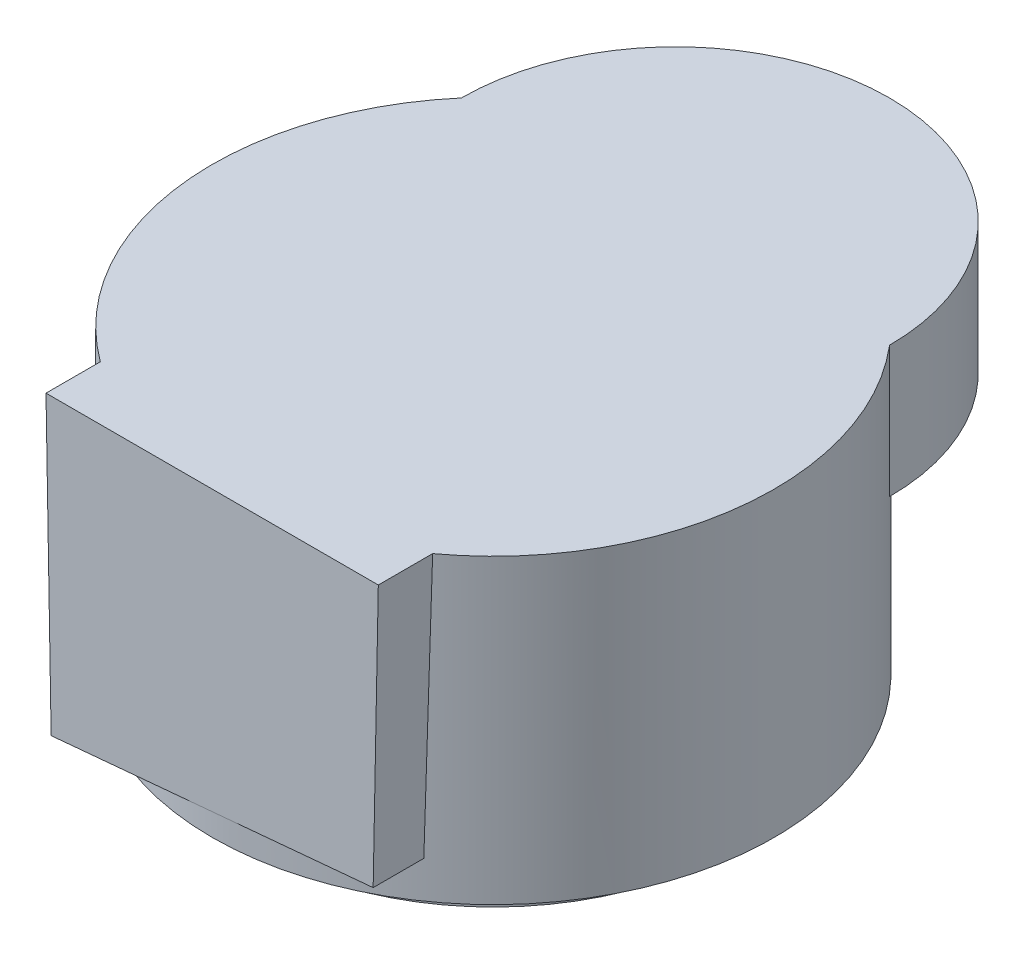
ISO-10303-21;
HEADER;
FILE_DESCRIPTION(('STEP AP214'),'2;1');
FILE_NAME('part.step','',(''),(''),'','','');
FILE_SCHEMA(('AUTOMOTIVE_DESIGN { 1 0 10303 214 1 1 1 1 }'));
ENDSEC;
DATA;
#1=APPLICATION_CONTEXT('core data for automotive mechanical design processes');
#2=APPLICATION_PROTOCOL_DEFINITION('international standard','automotive_design',2000,#1);
#3=PRODUCT_CONTEXT('',#1,'mechanical');
#4=PRODUCT('Part','Part','',(#3));
#5=PRODUCT_RELATED_PRODUCT_CATEGORY('part','',(#4));
#6=PRODUCT_DEFINITION_FORMATION('','',#4);
#7=PRODUCT_DEFINITION_CONTEXT('part definition',#1,'design');
#8=PRODUCT_DEFINITION('design','',#6,#7);
#9=PRODUCT_DEFINITION_SHAPE('','',#8);
#10=(LENGTH_UNIT() NAMED_UNIT(*) SI_UNIT(.MILLI.,.METRE.));
#11=(NAMED_UNIT(*) PLANE_ANGLE_UNIT() SI_UNIT($,.RADIAN.));
#12=(NAMED_UNIT(*) SI_UNIT($,.STERADIAN.) SOLID_ANGLE_UNIT());
#13=UNCERTAINTY_MEASURE_WITH_UNIT(LENGTH_MEASURE(1.E-05),#10,'distance_accuracy_value','');
#14=(GEOMETRIC_REPRESENTATION_CONTEXT(3) GLOBAL_UNCERTAINTY_ASSIGNED_CONTEXT((#13)) GLOBAL_UNIT_ASSIGNED_CONTEXT((#10,
#11,#12)) REPRESENTATION_CONTEXT('',''));
#15=CARTESIAN_POINT('',(0.,0.,0.));
#16=DIRECTION('',(0.,0.,1.));
#17=DIRECTION('',(1.,0.,0.));
#18=AXIS2_PLACEMENT_3D('',#15,#16,#17);
#19=CARTESIAN_POINT('',(0.,1.15,0.));
#20=DIRECTION('',(0.,-1.,0.));
#21=DIRECTION('',(0.,0.,-1.));
#22=AXIS2_PLACEMENT_3D('',#19,#20,#21);
#23=CYLINDRICAL_SURFACE('',#22,8.035);
#24=CARTESIAN_POINT('',(0.,1.15,0.));
#25=DIRECTION('',(0.,1.,0.));
#26=DIRECTION('',(0.,0.,1.));
#27=AXIS2_PLACEMENT_3D('',#24,#25,#26);
#28=CIRCLE('',#27,8.035);
#29=CARTESIAN_POINT('',(0.,1.15,8.035));
#30=VERTEX_POINT('',#29);
#31=EDGE_CURVE('E149',#30,#30,#28,.T.);
#32=ORIENTED_EDGE('',*,*,#31,.F.);
#33=EDGE_LOOP('',(#32));
#34=FACE_BOUND('',#33,.T.);
#35=CARTESIAN_POINT('',(0.,0.,0.));
#36=DIRECTION('',(0.,1.,0.));
#37=DIRECTION('',(0.,0.,1.));
#38=AXIS2_PLACEMENT_3D('',#35,#36,#37);
#39=CIRCLE('',#38,8.035);
#40=CARTESIAN_POINT('',(0.,0.,8.035));
#41=VERTEX_POINT('',#40);
#42=EDGE_CURVE('E145',#41,#41,#39,.T.);
#43=ORIENTED_EDGE('',*,*,#42,.T.);
#44=EDGE_LOOP('',(#43));
#45=FACE_BOUND('',#44,.T.);
#46=ADVANCED_FACE('F43',(#34,#45),#23,.T.);
#47=CARTESIAN_POINT('',(0.,0.,0.));
#48=DIRECTION('',(0.,1.,0.));
#49=DIRECTION('',(0.,0.,1.));
#50=AXIS2_PLACEMENT_3D('',#47,#48,#49);
#51=PLANE('',#50);
#52=ORIENTED_EDGE('',*,*,#42,.F.);
#53=EDGE_LOOP('',(#52));
#54=FACE_BOUND('',#53,.T.);
#55=ADVANCED_FACE('F186',(#54),#51,.F.);
#56=CARTESIAN_POINT('',(0.,11.41,0.));
#57=DIRECTION('',(0.,-1.,0.));
#58=DIRECTION('',(0.,0.,-1.));
#59=AXIS2_PLACEMENT_3D('',#56,#57,#58);
#60=CYLINDRICAL_SURFACE('',#59,9.56);
#61=CARTESIAN_POINT('',(0.,11.41,0.));
#62=DIRECTION('',(0.,1.,0.));
#63=DIRECTION('',(0.,0.,1.));
#64=AXIS2_PLACEMENT_3D('',#61,#62,#63);
#65=CIRCLE('',#64,9.56);
#66=CARTESIAN_POINT('',(5.65,11.41,7.71175077398122));
#67=VERTEX_POINT('',#66);
#68=CARTESIAN_POINT('',(7.28002476057905,11.41,-6.19635695270664));
#69=VERTEX_POINT('',#68);
#70=EDGE_CURVE('E146',#67,#69,#65,.T.);
#71=ORIENTED_EDGE('',*,*,#70,.F.);
#72=CARTESIAN_POINT('',(0.,-279.161428571425,0.));
#73=DIRECTION('',(0.999811010379242,-0.0194407696462633,0.));
#74=DIRECTION('',(-0.0194407696462633,-0.999811010379242,0.));
#75=AXIS2_PLACEMENT_3D('',#72,#73,#74);
#76=ELLIPSE('',#75,491.750078517983,9.56);
#77=CARTESIAN_POINT('',(5.475,2.41,7.83696210275385));
#78=VERTEX_POINT('',#77);
#79=EDGE_CURVE('E126',#67,#78,#76,.T.);
#80=ORIENTED_EDGE('',*,*,#79,.T.);
#81=CARTESIAN_POINT('',(0.,1.91,0.));
#82=DIRECTION('',(0.0909457396553839,-0.995855849226451,0.));
#83=DIRECTION('',(-0.995855849226451,-0.0909457396553839,0.));
#84=AXIS2_PLACEMENT_3D('',#81,#82,#83);
#85=ELLIPSE('',#84,9.59978294792957,9.56);
#86=CARTESIAN_POINT('',(0.,1.91,9.56));
#87=VERTEX_POINT('',#86);
#88=EDGE_CURVE('E11',#78,#87,#85,.T.);
#89=ORIENTED_EDGE('',*,*,#88,.T.);
#90=CARTESIAN_POINT('',(-5.475,1.41,7.83696210275384));
#91=VERTEX_POINT('',#90);
#92=EDGE_CURVE('E46',#87,#91,#85,.T.);
#93=ORIENTED_EDGE('',*,*,#92,.T.);
#94=CARTESIAN_POINT('',(0.,-311.447142857145,0.));
#95=DIRECTION('',(-0.999846910161925,-0.0174973209278336,0.));
#96=DIRECTION('',(0.0174973209278336,-0.999846910161925,0.));
#97=AXIS2_PLACEMENT_3D('',#94,#95,#96);
#98=ELLIPSE('',#97,546.369357882245,9.56);
#99=CARTESIAN_POINT('',(-5.65,11.41,7.71175077398122));
#100=VERTEX_POINT('',#99);
#101=EDGE_CURVE('E102',#91,#100,#98,.T.);
#102=ORIENTED_EDGE('',*,*,#101,.T.);
#103=CARTESIAN_POINT('',(-7.28002476057905,11.41,-6.19635695270664));
#104=VERTEX_POINT('',#103);
#105=EDGE_CURVE('E143',#104,#100,#65,.T.);
#106=ORIENTED_EDGE('',*,*,#105,.F.);
#107=DIRECTION('',(0.,1.,0.));
#108=VECTOR('',#107,1.);
#109=CARTESIAN_POINT('',(-7.28002476057905,6.95,-6.19635695270664));
#110=LINE('',#109,#108);
#111=CARTESIAN_POINT('',(-7.28002476057905,6.95,-6.19635695270664));
#112=VERTEX_POINT('',#111);
#113=EDGE_CURVE('E138',#112,#104,#110,.T.);
#114=ORIENTED_EDGE('',*,*,#113,.F.);
#115=CARTESIAN_POINT('',(0.,6.95,0.));
#116=DIRECTION('',(0.,1.,0.));
#117=DIRECTION('',(0.,0.,1.));
#118=AXIS2_PLACEMENT_3D('',#115,#116,#117);
#119=CIRCLE('',#118,9.56);
#120=CARTESIAN_POINT('',(7.28002476057905,6.95,-6.19635695270664));
#121=VERTEX_POINT('',#120);
#122=EDGE_CURVE('E152',#121,#112,#119,.T.);
#123=ORIENTED_EDGE('',*,*,#122,.F.);
#124=DIRECTION('',(0.,1.,0.));
#125=VECTOR('',#124,1.);
#126=CARTESIAN_POINT('',(7.28002476057905,6.95,-6.19635695270664));
#127=LINE('',#126,#125);
#128=EDGE_CURVE('E136',#121,#69,#127,.T.);
#129=ORIENTED_EDGE('',*,*,#128,.T.);
#130=EDGE_LOOP('',(#71,#80,#89,#93,#102,#106,#114,#123,#129));
#131=FACE_BOUND('',#130,.T.);
#132=CARTESIAN_POINT('',(0.,1.15,0.));
#133=DIRECTION('',(0.,1.,0.));
#134=DIRECTION('',(0.,0.,1.));
#135=AXIS2_PLACEMENT_3D('',#132,#133,#134);
#136=CIRCLE('',#135,9.56);
#137=CARTESIAN_POINT('',(0.,1.15,9.56));
#138=VERTEX_POINT('',#137);
#139=EDGE_CURVE('E140',#138,#138,#136,.T.);
#140=ORIENTED_EDGE('',*,*,#139,.T.);
#141=EDGE_LOOP('',(#140));
#142=FACE_BOUND('',#141,.T.);
#143=ADVANCED_FACE('F159',(#131,#142),#60,.T.);
#144=CARTESIAN_POINT('',(0.,11.41,0.));
#145=DIRECTION('',(0.,1.,0.));
#146=DIRECTION('',(0.,0.,1.));
#147=AXIS2_PLACEMENT_3D('',#144,#145,#146);
#148=PLANE('',#147);
#149=ORIENTED_EDGE('',*,*,#105,.T.);
#150=DIRECTION('',(0.,0.,1.));
#151=VECTOR('',#150,1.);
#152=CARTESIAN_POINT('',(-5.65,11.41,5.1));
#153=LINE('',#152,#151);
#154=CARTESIAN_POINT('',(-5.65,11.41,9.56));
#155=VERTEX_POINT('',#154);
#156=EDGE_CURVE('E124',#100,#155,#153,.T.);
#157=ORIENTED_EDGE('',*,*,#156,.T.);
#158=DIRECTION('',(-1.,0.,0.));
#159=VECTOR('',#158,1.);
#160=CARTESIAN_POINT('',(-5.65,11.41,9.56));
#161=LINE('',#160,#159);
#162=CARTESIAN_POINT('',(5.65,11.41,9.56));
#163=VERTEX_POINT('',#162);
#164=EDGE_CURVE('E105',#163,#155,#161,.T.);
#165=ORIENTED_EDGE('',*,*,#164,.F.);
#166=DIRECTION('',(0.,0.,1.));
#167=VECTOR('',#166,1.);
#168=CARTESIAN_POINT('',(5.65,11.41,5.1));
#169=LINE('',#168,#167);
#170=EDGE_CURVE('E127',#67,#163,#169,.T.);
#171=ORIENTED_EDGE('',*,*,#170,.F.);
#172=ORIENTED_EDGE('',*,*,#70,.T.);
#173=CARTESIAN_POINT('',(0.,11.41,-6.19635695270663));
#174=DIRECTION('',(0.,1.,0.));
#175=DIRECTION('',(0.,0.,-1.));
#176=AXIS2_PLACEMENT_3D('',#173,#174,#175);
#177=CIRCLE('',#176,7.28002476057905);
#178=EDGE_CURVE('E65',#69,#104,#177,.T.);
#179=ORIENTED_EDGE('',*,*,#178,.T.);
#180=EDGE_LOOP('',(#149,#157,#165,#171,#172,#179));
#181=FACE_BOUND('',#180,.T.);
#182=ADVANCED_FACE('F169',(#181),#148,.T.);
#183=CARTESIAN_POINT('',(0.,1.15,0.));
#184=DIRECTION('',(0.,1.,0.));
#185=DIRECTION('',(0.,0.,1.));
#186=AXIS2_PLACEMENT_3D('',#183,#184,#185);
#187=PLANE('',#186);
#188=ORIENTED_EDGE('',*,*,#31,.T.);
#189=EDGE_LOOP('',(#188));
#190=FACE_BOUND('',#189,.T.);
#191=ORIENTED_EDGE('',*,*,#139,.F.);
#192=EDGE_LOOP('',(#191));
#193=FACE_BOUND('',#192,.T.);
#194=ADVANCED_FACE('F175',(#190,#193),#187,.F.);
#195=CARTESIAN_POINT('',(0.,6.95,-3.09817847635332));
#196=DIRECTION('',(0.,1.,0.));
#197=DIRECTION('',(0.,0.,1.));
#198=AXIS2_PLACEMENT_3D('',#195,#196,#197);
#199=PLANE('',#198);
#200=CARTESIAN_POINT('',(0.,6.95,-6.19635695270663));
#201=DIRECTION('',(0.,1.,0.));
#202=DIRECTION('',(0.,0.,-1.));
#203=AXIS2_PLACEMENT_3D('',#200,#201,#202);
#204=CIRCLE('',#203,7.28002476057905);
#205=EDGE_CURVE('E133',#121,#112,#204,.T.);
#206=ORIENTED_EDGE('',*,*,#205,.F.);
#207=ORIENTED_EDGE('',*,*,#122,.T.);
#208=EDGE_LOOP('',(#206,#207));
#209=FACE_BOUND('',#208,.T.);
#210=ADVANCED_FACE('F173',(#209),#199,.F.);
#211=CARTESIAN_POINT('',(0.,6.95,-6.19635695270663));
#212=DIRECTION('',(0.,1.,0.));
#213=DIRECTION('',(0.,0.,1.));
#214=AXIS2_PLACEMENT_3D('',#211,#212,#213);
#215=CYLINDRICAL_SURFACE('',#214,7.28002476057905);
#216=ORIENTED_EDGE('',*,*,#178,.F.);
#217=ORIENTED_EDGE('',*,*,#128,.F.);
#218=ORIENTED_EDGE('',*,*,#205,.T.);
#219=ORIENTED_EDGE('',*,*,#113,.T.);
#220=EDGE_LOOP('',(#216,#217,#218,#219));
#221=FACE_BOUND('',#220,.T.);
#222=ADVANCED_FACE('F172',(#221),#215,.T.);
#223=CARTESIAN_POINT('',(-5.475,1.41,5.1));
#224=DIRECTION('',(0.0909457396553839,-0.995855849226451,0.));
#225=DIRECTION('',(0.995855849226451,0.0909457396553839,0.));
#226=AXIS2_PLACEMENT_3D('',#223,#224,#225);
#227=PLANE('',#226);
#228=ORIENTED_EDGE('',*,*,#88,.F.);
#229=DIRECTION('',(0.,0.,1.));
#230=VECTOR('',#229,1.);
#231=CARTESIAN_POINT('',(5.475,2.41,5.1));
#232=LINE('',#231,#230);
#233=CARTESIAN_POINT('',(5.475,2.41,9.56));
#234=VERTEX_POINT('',#233);
#235=EDGE_CURVE('E104',#78,#234,#232,.T.);
#236=ORIENTED_EDGE('',*,*,#235,.T.);
#237=DIRECTION('',(0.995855849226451,0.0909457396553839,0.));
#238=VECTOR('',#237,1.);
#239=CARTESIAN_POINT('',(-5.475,1.41,9.56));
#240=LINE('',#239,#238);
#241=EDGE_CURVE('E114',#87,#234,#240,.T.);
#242=ORIENTED_EDGE('',*,*,#241,.F.);
#243=EDGE_LOOP('',(#228,#236,#242));
#244=FACE_BOUND('',#243,.T.);
#245=ADVANCED_FACE('F164',(#244),#227,.T.);
#246=CARTESIAN_POINT('',(-5.475,1.41,5.1));
#247=DIRECTION('',(-0.999846910161925,-0.0174973209278336,0.));
#248=DIRECTION('',(0.0174973209278336,-0.999846910161925,0.));
#249=AXIS2_PLACEMENT_3D('',#246,#247,#248);
#250=PLANE('',#249);
#251=ORIENTED_EDGE('',*,*,#101,.F.);
#252=DIRECTION('',(0.,0.,1.));
#253=VECTOR('',#252,1.);
#254=CARTESIAN_POINT('',(-5.475,1.41,5.1));
#255=LINE('',#254,#253);
#256=CARTESIAN_POINT('',(-5.475,1.41,9.56));
#257=VERTEX_POINT('',#256);
#258=EDGE_CURVE('E57',#91,#257,#255,.T.);
#259=ORIENTED_EDGE('',*,*,#258,.T.);
#260=DIRECTION('',(0.0174973209278336,-0.999846910161925,0.));
#261=VECTOR('',#260,1.);
#262=CARTESIAN_POINT('',(-5.475,1.41,9.56));
#263=LINE('',#262,#261);
#264=EDGE_CURVE('E100',#155,#257,#263,.T.);
#265=ORIENTED_EDGE('',*,*,#264,.F.);
#266=ORIENTED_EDGE('',*,*,#156,.F.);
#267=EDGE_LOOP('',(#251,#259,#265,#266));
#268=FACE_BOUND('',#267,.T.);
#269=ADVANCED_FACE('F98',(#268),#250,.T.);
#270=CARTESIAN_POINT('',(5.475,2.41,5.1));
#271=DIRECTION('',(0.999811010379242,-0.0194407696462633,0.));
#272=DIRECTION('',(0.0194407696462633,0.999811010379242,0.));
#273=AXIS2_PLACEMENT_3D('',#270,#271,#272);
#274=PLANE('',#273);
#275=ORIENTED_EDGE('',*,*,#79,.F.);
#276=ORIENTED_EDGE('',*,*,#170,.T.);
#277=DIRECTION('',(0.0194407696462633,0.999811010379242,0.));
#278=VECTOR('',#277,1.);
#279=CARTESIAN_POINT('',(5.475,2.41,9.56));
#280=LINE('',#279,#278);
#281=EDGE_CURVE('E113',#234,#163,#280,.T.);
#282=ORIENTED_EDGE('',*,*,#281,.F.);
#283=ORIENTED_EDGE('',*,*,#235,.F.);
#284=EDGE_LOOP('',(#275,#276,#282,#283));
#285=FACE_BOUND('',#284,.T.);
#286=ADVANCED_FACE('F167',(#285),#274,.T.);
#287=CARTESIAN_POINT('',(0.,0.,9.56));
#288=DIRECTION('',(0.,0.,-1.));
#289=DIRECTION('',(-1.,0.,0.));
#290=AXIS2_PLACEMENT_3D('',#287,#288,#289);
#291=PLANE('',#290);
#292=ORIENTED_EDGE('',*,*,#164,.T.);
#293=ORIENTED_EDGE('',*,*,#264,.T.);
#294=EDGE_CURVE('E108',#257,#87,#240,.T.);
#295=ORIENTED_EDGE('',*,*,#294,.T.);
#296=ORIENTED_EDGE('',*,*,#241,.T.);
#297=ORIENTED_EDGE('',*,*,#281,.T.);
#298=EDGE_LOOP('',(#292,#293,#295,#296,#297));
#299=FACE_BOUND('',#298,.T.);
#300=ADVANCED_FACE('F116',(#299),#291,.F.);
#301=ORIENTED_EDGE('',*,*,#92,.F.);
#302=ORIENTED_EDGE('',*,*,#294,.F.);
#303=ORIENTED_EDGE('',*,*,#258,.F.);
#304=EDGE_LOOP('',(#301,#302,#303));
#305=FACE_BOUND('',#304,.T.);
#306=ADVANCED_FACE('F109',(#305),#227,.T.);
#307=CLOSED_SHELL('',(#46,#55,#143,#182,#194,#210,#222,#245,#269,#286,#300,#306));
#308=MANIFOLD_SOLID_BREP('B2',#307);
#309=ADVANCED_BREP_SHAPE_REPRESENTATION('',(#18,#308),#14);
#310=SHAPE_DEFINITION_REPRESENTATION(#9,#309);
ENDSEC;
END-ISO-10303-21;
